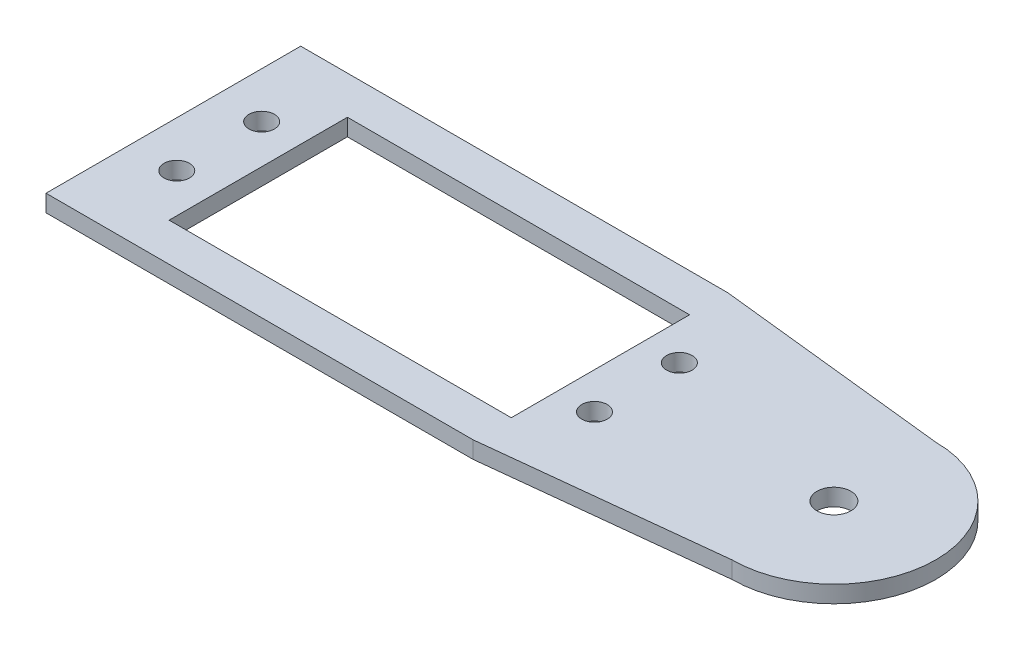
ISO-10303-21;
HEADER;
FILE_DESCRIPTION(('STEP AP214'),'2;1');
FILE_NAME('part.step','',(''),(''),'','','');
FILE_SCHEMA(('AUTOMOTIVE_DESIGN { 1 0 10303 214 1 1 1 1 }'));
ENDSEC;
DATA;
#1=APPLICATION_CONTEXT('core data for automotive mechanical design processes');
#2=APPLICATION_PROTOCOL_DEFINITION('international standard','automotive_design',2000,#1);
#3=PRODUCT_CONTEXT('',#1,'mechanical');
#4=PRODUCT('Part','Part','',(#3));
#5=PRODUCT_RELATED_PRODUCT_CATEGORY('part','',(#4));
#6=PRODUCT_DEFINITION_FORMATION('','',#4);
#7=PRODUCT_DEFINITION_CONTEXT('part definition',#1,'design');
#8=PRODUCT_DEFINITION('design','',#6,#7);
#9=PRODUCT_DEFINITION_SHAPE('','',#8);
#10=(LENGTH_UNIT() NAMED_UNIT(*) SI_UNIT(.MILLI.,.METRE.));
#11=(NAMED_UNIT(*) PLANE_ANGLE_UNIT() SI_UNIT($,.RADIAN.));
#12=(NAMED_UNIT(*) SI_UNIT($,.STERADIAN.) SOLID_ANGLE_UNIT());
#13=UNCERTAINTY_MEASURE_WITH_UNIT(LENGTH_MEASURE(1.E-05),#10,'distance_accuracy_value','');
#14=(GEOMETRIC_REPRESENTATION_CONTEXT(3) GLOBAL_UNCERTAINTY_ASSIGNED_CONTEXT((#13)) GLOBAL_UNIT_ASSIGNED_CONTEXT((#10,
#11,#12)) REPRESENTATION_CONTEXT('',''));
#15=CARTESIAN_POINT('',(0.,0.,0.));
#16=DIRECTION('',(0.,0.,1.));
#17=DIRECTION('',(1.,0.,0.));
#18=AXIS2_PLACEMENT_3D('',#15,#16,#17);
#19=CARTESIAN_POINT('',(77.8,2.,0.));
#20=DIRECTION('',(0.,1.,0.));
#21=DIRECTION('',(0.,0.,1.));
#22=AXIS2_PLACEMENT_3D('',#19,#20,#21);
#23=PLANE('',#22);
#24=CARTESIAN_POINT('',(54.6,2.,-5.));
#25=DIRECTION('',(0.,1.,0.));
#26=DIRECTION('',(0.,0.,1.));
#27=AXIS2_PLACEMENT_3D('',#24,#25,#26);
#28=CIRCLE('',#27,1.5);
#29=CARTESIAN_POINT('',(54.6,2.,-3.5));
#30=VERTEX_POINT('',#29);
#31=EDGE_CURVE('E279',#30,#30,#28,.T.);
#32=ORIENTED_EDGE('',*,*,#31,.F.);
#33=EDGE_LOOP('',(#32));
#34=FACE_BOUND('',#33,.T.);
#35=CARTESIAN_POINT('',(5.4,2.,-5.));
#36=DIRECTION('',(0.,1.,0.));
#37=DIRECTION('',(0.,0.,1.));
#38=AXIS2_PLACEMENT_3D('',#35,#36,#37);
#39=CIRCLE('',#38,1.5);
#40=CARTESIAN_POINT('',(5.4,2.,-3.5));
#41=VERTEX_POINT('',#40);
#42=EDGE_CURVE('E291',#41,#41,#39,.T.);
#43=ORIENTED_EDGE('',*,*,#42,.F.);
#44=EDGE_LOOP('',(#43));
#45=FACE_BOUND('',#44,.T.);
#46=DIRECTION('',(1.,0.,0.));
#47=VECTOR('',#46,1.);
#48=CARTESIAN_POINT('',(10.,2.,10.5));
#49=LINE('',#48,#47);
#50=CARTESIAN_POINT('',(10.,2.,10.5));
#51=VERTEX_POINT('',#50);
#52=CARTESIAN_POINT('',(50.3,2.,10.5));
#53=VERTEX_POINT('',#52);
#54=EDGE_CURVE('E120',#51,#53,#49,.T.);
#55=ORIENTED_EDGE('',*,*,#54,.F.);
#56=DIRECTION('',(0.,0.,1.));
#57=VECTOR('',#56,1.);
#58=CARTESIAN_POINT('',(10.,2.,10.5));
#59=LINE('',#58,#57);
#60=CARTESIAN_POINT('',(9.99999999999999,2.,-10.5));
#61=VERTEX_POINT('',#60);
#62=EDGE_CURVE('E112',#61,#51,#59,.T.);
#63=ORIENTED_EDGE('',*,*,#62,.F.);
#64=DIRECTION('',(-1.,0.,0.));
#65=VECTOR('',#64,1.);
#66=CARTESIAN_POINT('',(9.99999999999999,2.,-10.5));
#67=LINE('',#66,#65);
#68=CARTESIAN_POINT('',(50.3,2.,-10.5));
#69=VERTEX_POINT('',#68);
#70=EDGE_CURVE('E135',#69,#61,#67,.T.);
#71=ORIENTED_EDGE('',*,*,#70,.F.);
#72=DIRECTION('',(0.,0.,-1.));
#73=VECTOR('',#72,1.);
#74=CARTESIAN_POINT('',(50.3,2.,-10.5));
#75=LINE('',#74,#73);
#76=EDGE_CURVE('E133',#53,#69,#75,.T.);
#77=ORIENTED_EDGE('',*,*,#76,.F.);
#78=EDGE_LOOP('',(#55,#63,#71,#77));
#79=FACE_BOUND('',#78,.T.);
#80=DIRECTION('',(-0.994102176607995,0.,-0.108447510175418));
#81=VECTOR('',#80,1.);
#82=CARTESIAN_POINT('',(50.3,2.,-15.));
#83=LINE('',#82,#81);
#84=CARTESIAN_POINT('',(77.8,2.,-12.));
#85=VERTEX_POINT('',#84);
#86=CARTESIAN_POINT('',(50.3,2.,-15.));
#87=VERTEX_POINT('',#86);
#88=EDGE_CURVE('E151',#85,#87,#83,.T.);
#89=ORIENTED_EDGE('',*,*,#88,.T.);
#90=DIRECTION('',(-1.,0.,0.));
#91=VECTOR('',#90,1.);
#92=CARTESIAN_POINT('',(0.,2.,-15.));
#93=LINE('',#92,#91);
#94=CARTESIAN_POINT('',(0.,2.,-15.));
#95=VERTEX_POINT('',#94);
#96=EDGE_CURVE('E154',#87,#95,#93,.T.);
#97=ORIENTED_EDGE('',*,*,#96,.T.);
#98=DIRECTION('',(0.,0.,1.));
#99=VECTOR('',#98,1.);
#100=CARTESIAN_POINT('',(0.,2.,-15.));
#101=LINE('',#100,#99);
#102=CARTESIAN_POINT('',(0.,2.,15.));
#103=VERTEX_POINT('',#102);
#104=EDGE_CURVE('E157',#95,#103,#101,.T.);
#105=ORIENTED_EDGE('',*,*,#104,.T.);
#106=DIRECTION('',(1.,0.,0.));
#107=VECTOR('',#106,1.);
#108=CARTESIAN_POINT('',(0.,2.,15.));
#109=LINE('',#108,#107);
#110=CARTESIAN_POINT('',(50.3,2.,15.));
#111=VERTEX_POINT('',#110);
#112=EDGE_CURVE('E159',#103,#111,#109,.T.);
#113=ORIENTED_EDGE('',*,*,#112,.T.);
#114=DIRECTION('',(0.994102176607995,0.,-0.108447510175418));
#115=VECTOR('',#114,1.);
#116=CARTESIAN_POINT('',(50.3,2.,15.));
#117=LINE('',#116,#115);
#118=CARTESIAN_POINT('',(77.8,2.,12.));
#119=VERTEX_POINT('',#118);
#120=EDGE_CURVE('E161',#111,#119,#117,.T.);
#121=ORIENTED_EDGE('',*,*,#120,.T.);
#122=CARTESIAN_POINT('',(77.8,2.,0.));
#123=DIRECTION('',(0.,1.,0.));
#124=DIRECTION('',(0.,0.,1.));
#125=AXIS2_PLACEMENT_3D('',#122,#123,#124);
#126=CIRCLE('',#125,12.);
#127=EDGE_CURVE('E163',#119,#85,#126,.T.);
#128=ORIENTED_EDGE('',*,*,#127,.T.);
#129=EDGE_LOOP('',(#89,#97,#105,#113,#121,#128));
#130=FACE_BOUND('',#129,.T.);
#131=CARTESIAN_POINT('',(5.4,2.,5.));
#132=DIRECTION('',(0.,1.,0.));
#133=DIRECTION('',(0.,0.,1.));
#134=AXIS2_PLACEMENT_3D('',#131,#132,#133);
#135=CIRCLE('',#134,1.5);
#136=CARTESIAN_POINT('',(5.4,2.,6.5));
#137=VERTEX_POINT('',#136);
#138=EDGE_CURVE('E141',#137,#137,#135,.T.);
#139=ORIENTED_EDGE('',*,*,#138,.F.);
#140=EDGE_LOOP('',(#139));
#141=FACE_BOUND('',#140,.T.);
#142=CARTESIAN_POINT('',(54.6,2.,5.));
#143=DIRECTION('',(0.,1.,0.));
#144=DIRECTION('',(0.,0.,1.));
#145=AXIS2_PLACEMENT_3D('',#142,#143,#144);
#146=CIRCLE('',#145,1.5);
#147=CARTESIAN_POINT('',(54.6,2.,6.5));
#148=VERTEX_POINT('',#147);
#149=EDGE_CURVE('E285',#148,#148,#146,.T.);
#150=ORIENTED_EDGE('',*,*,#149,.F.);
#151=EDGE_LOOP('',(#150));
#152=FACE_BOUND('',#151,.T.);
#153=CARTESIAN_POINT('',(77.8,2.,0.));
#154=DIRECTION('',(0.,1.,0.));
#155=DIRECTION('',(0.,0.,1.));
#156=AXIS2_PLACEMENT_3D('',#153,#154,#155);
#157=CIRCLE('',#156,2.);
#158=CARTESIAN_POINT('',(77.8,2.,2.));
#159=VERTEX_POINT('',#158);
#160=EDGE_CURVE('E270',#159,#159,#157,.T.);
#161=ORIENTED_EDGE('',*,*,#160,.F.);
#162=EDGE_LOOP('',(#161));
#163=FACE_BOUND('',#162,.T.);
#164=ADVANCED_FACE('F35',(#34,#45,#79,#130,#141,#152,#163),#23,.T.);
#165=CARTESIAN_POINT('',(77.8,0.,0.));
#166=DIRECTION('',(0.,1.,0.));
#167=DIRECTION('',(0.,0.,1.));
#168=AXIS2_PLACEMENT_3D('',#165,#166,#167);
#169=PLANE('',#168);
#170=DIRECTION('',(-0.994102176607995,0.,-0.108447510175418));
#171=VECTOR('',#170,1.);
#172=CARTESIAN_POINT('',(50.3,0.,-15.));
#173=LINE('',#172,#171);
#174=CARTESIAN_POINT('',(77.8,0.,-12.));
#175=VERTEX_POINT('',#174);
#176=CARTESIAN_POINT('',(50.3,0.,-15.));
#177=VERTEX_POINT('',#176);
#178=EDGE_CURVE('E128',#175,#177,#173,.T.);
#179=ORIENTED_EDGE('',*,*,#178,.F.);
#180=CARTESIAN_POINT('',(77.8,0.,0.));
#181=DIRECTION('',(0.,1.,0.));
#182=DIRECTION('',(0.,0.,1.));
#183=AXIS2_PLACEMENT_3D('',#180,#181,#182);
#184=CIRCLE('',#183,12.);
#185=CARTESIAN_POINT('',(77.8,0.,12.));
#186=VERTEX_POINT('',#185);
#187=EDGE_CURVE('E155',#186,#175,#184,.T.);
#188=ORIENTED_EDGE('',*,*,#187,.F.);
#189=DIRECTION('',(0.994102176607995,0.,-0.108447510175418));
#190=VECTOR('',#189,1.);
#191=CARTESIAN_POINT('',(50.3,0.,15.));
#192=LINE('',#191,#190);
#193=CARTESIAN_POINT('',(50.3,0.,15.));
#194=VERTEX_POINT('',#193);
#195=EDGE_CURVE('E174',#194,#186,#192,.T.);
#196=ORIENTED_EDGE('',*,*,#195,.F.);
#197=DIRECTION('',(1.,0.,0.));
#198=VECTOR('',#197,1.);
#199=CARTESIAN_POINT('',(0.,0.,15.));
#200=LINE('',#199,#198);
#201=CARTESIAN_POINT('',(0.,0.,15.));
#202=VERTEX_POINT('',#201);
#203=EDGE_CURVE('E172',#202,#194,#200,.T.);
#204=ORIENTED_EDGE('',*,*,#203,.F.);
#205=DIRECTION('',(0.,0.,1.));
#206=VECTOR('',#205,1.);
#207=CARTESIAN_POINT('',(0.,0.,-15.));
#208=LINE('',#207,#206);
#209=CARTESIAN_POINT('',(0.,0.,-15.));
#210=VERTEX_POINT('',#209);
#211=EDGE_CURVE('E170',#210,#202,#208,.T.);
#212=ORIENTED_EDGE('',*,*,#211,.F.);
#213=DIRECTION('',(-1.,0.,0.));
#214=VECTOR('',#213,1.);
#215=CARTESIAN_POINT('',(0.,0.,-15.));
#216=LINE('',#215,#214);
#217=EDGE_CURVE('E168',#177,#210,#216,.T.);
#218=ORIENTED_EDGE('',*,*,#217,.F.);
#219=EDGE_LOOP('',(#179,#188,#196,#204,#212,#218));
#220=FACE_BOUND('',#219,.T.);
#221=DIRECTION('',(0.,0.,1.));
#222=VECTOR('',#221,1.);
#223=CARTESIAN_POINT('',(10.,0.,10.5));
#224=LINE('',#223,#222);
#225=CARTESIAN_POINT('',(9.99999999999999,0.,-10.5));
#226=VERTEX_POINT('',#225);
#227=CARTESIAN_POINT('',(10.,0.,10.5));
#228=VERTEX_POINT('',#227);
#229=EDGE_CURVE('E58',#226,#228,#224,.T.);
#230=ORIENTED_EDGE('',*,*,#229,.T.);
#231=DIRECTION('',(1.,0.,0.));
#232=VECTOR('',#231,1.);
#233=CARTESIAN_POINT('',(10.,0.,10.5));
#234=LINE('',#233,#232);
#235=CARTESIAN_POINT('',(50.3,0.,10.5));
#236=VERTEX_POINT('',#235);
#237=EDGE_CURVE('E127',#228,#236,#234,.T.);
#238=ORIENTED_EDGE('',*,*,#237,.T.);
#239=DIRECTION('',(0.,0.,-1.));
#240=VECTOR('',#239,1.);
#241=CARTESIAN_POINT('',(50.3,0.,-10.5));
#242=LINE('',#241,#240);
#243=CARTESIAN_POINT('',(50.3,0.,-10.5));
#244=VERTEX_POINT('',#243);
#245=EDGE_CURVE('E143',#236,#244,#242,.T.);
#246=ORIENTED_EDGE('',*,*,#245,.T.);
#247=DIRECTION('',(-1.,0.,0.));
#248=VECTOR('',#247,1.);
#249=CARTESIAN_POINT('',(9.99999999999999,0.,-10.5));
#250=LINE('',#249,#248);
#251=EDGE_CURVE('E121',#244,#226,#250,.T.);
#252=ORIENTED_EDGE('',*,*,#251,.T.);
#253=EDGE_LOOP('',(#230,#238,#246,#252));
#254=FACE_BOUND('',#253,.T.);
#255=CARTESIAN_POINT('',(5.4,0.,5.));
#256=DIRECTION('',(0.,1.,0.));
#257=DIRECTION('',(0.,0.,1.));
#258=AXIS2_PLACEMENT_3D('',#255,#256,#257);
#259=CIRCLE('',#258,1.5);
#260=CARTESIAN_POINT('',(5.4,0.,6.5));
#261=VERTEX_POINT('',#260);
#262=EDGE_CURVE('E294',#261,#261,#259,.T.);
#263=ORIENTED_EDGE('',*,*,#262,.T.);
#264=EDGE_LOOP('',(#263));
#265=FACE_BOUND('',#264,.T.);
#266=CARTESIAN_POINT('',(5.4,0.,-5.));
#267=DIRECTION('',(0.,1.,0.));
#268=DIRECTION('',(0.,0.,1.));
#269=AXIS2_PLACEMENT_3D('',#266,#267,#268);
#270=CIRCLE('',#269,1.5);
#271=CARTESIAN_POINT('',(5.4,0.,-3.5));
#272=VERTEX_POINT('',#271);
#273=EDGE_CURVE('E288',#272,#272,#270,.T.);
#274=ORIENTED_EDGE('',*,*,#273,.T.);
#275=EDGE_LOOP('',(#274));
#276=FACE_BOUND('',#275,.T.);
#277=CARTESIAN_POINT('',(54.6,0.,5.));
#278=DIRECTION('',(0.,1.,0.));
#279=DIRECTION('',(0.,0.,1.));
#280=AXIS2_PLACEMENT_3D('',#277,#278,#279);
#281=CIRCLE('',#280,1.5);
#282=CARTESIAN_POINT('',(54.6,0.,6.5));
#283=VERTEX_POINT('',#282);
#284=EDGE_CURVE('E282',#283,#283,#281,.T.);
#285=ORIENTED_EDGE('',*,*,#284,.T.);
#286=EDGE_LOOP('',(#285));
#287=FACE_BOUND('',#286,.T.);
#288=CARTESIAN_POINT('',(54.6,0.,-5.));
#289=DIRECTION('',(0.,1.,0.));
#290=DIRECTION('',(0.,0.,1.));
#291=AXIS2_PLACEMENT_3D('',#288,#289,#290);
#292=CIRCLE('',#291,1.5);
#293=CARTESIAN_POINT('',(54.6,0.,-3.5));
#294=VERTEX_POINT('',#293);
#295=EDGE_CURVE('E276',#294,#294,#292,.T.);
#296=ORIENTED_EDGE('',*,*,#295,.T.);
#297=EDGE_LOOP('',(#296));
#298=FACE_BOUND('',#297,.T.);
#299=CARTESIAN_POINT('',(77.8,0.,0.));
#300=DIRECTION('',(0.,1.,0.));
#301=DIRECTION('',(0.,0.,1.));
#302=AXIS2_PLACEMENT_3D('',#299,#300,#301);
#303=CIRCLE('',#302,2.);
#304=CARTESIAN_POINT('',(77.8,0.,2.));
#305=VERTEX_POINT('',#304);
#306=EDGE_CURVE('E273',#305,#305,#303,.T.);
#307=ORIENTED_EDGE('',*,*,#306,.T.);
#308=EDGE_LOOP('',(#307));
#309=FACE_BOUND('',#308,.T.);
#310=ADVANCED_FACE('F198',(#220,#254,#265,#276,#287,#298,#309),#169,.F.);
#311=CARTESIAN_POINT('',(50.3,2.,-15.));
#312=DIRECTION('',(-0.108447510175418,0.,0.994102176607995));
#313=DIRECTION('',(0.994102176607995,0.,0.108447510175418));
#314=AXIS2_PLACEMENT_3D('',#311,#312,#313);
#315=PLANE('',#314);
#316=ORIENTED_EDGE('',*,*,#178,.T.);
#317=DIRECTION('',(0.,-1.,0.));
#318=VECTOR('',#317,1.);
#319=CARTESIAN_POINT('',(50.3,2.,-15.));
#320=LINE('',#319,#318);
#321=EDGE_CURVE('E11',#87,#177,#320,.T.);
#322=ORIENTED_EDGE('',*,*,#321,.F.);
#323=ORIENTED_EDGE('',*,*,#88,.F.);
#324=DIRECTION('',(0.,-1.,0.));
#325=VECTOR('',#324,1.);
#326=CARTESIAN_POINT('',(77.8,2.,-12.));
#327=LINE('',#326,#325);
#328=EDGE_CURVE('E165',#85,#175,#327,.T.);
#329=ORIENTED_EDGE('',*,*,#328,.T.);
#330=EDGE_LOOP('',(#316,#322,#323,#329));
#331=FACE_BOUND('',#330,.T.);
#332=ADVANCED_FACE('F37',(#331),#315,.F.);
#333=CARTESIAN_POINT('',(0.,2.,-15.));
#334=DIRECTION('',(0.,0.,1.));
#335=DIRECTION('',(1.,0.,0.));
#336=AXIS2_PLACEMENT_3D('',#333,#334,#335);
#337=PLANE('',#336);
#338=ORIENTED_EDGE('',*,*,#217,.T.);
#339=DIRECTION('',(0.,-1.,0.));
#340=VECTOR('',#339,1.);
#341=CARTESIAN_POINT('',(0.,2.,-15.));
#342=LINE('',#341,#340);
#343=EDGE_CURVE('E43',#95,#210,#342,.T.);
#344=ORIENTED_EDGE('',*,*,#343,.F.);
#345=ORIENTED_EDGE('',*,*,#96,.F.);
#346=ORIENTED_EDGE('',*,*,#321,.T.);
#347=EDGE_LOOP('',(#338,#344,#345,#346));
#348=FACE_BOUND('',#347,.T.);
#349=ADVANCED_FACE('F215',(#348),#337,.F.);
#350=CARTESIAN_POINT('',(0.,2.,-15.));
#351=DIRECTION('',(1.,0.,0.));
#352=DIRECTION('',(0.,0.,-1.));
#353=AXIS2_PLACEMENT_3D('',#350,#351,#352);
#354=PLANE('',#353);
#355=ORIENTED_EDGE('',*,*,#211,.T.);
#356=DIRECTION('',(0.,-1.,0.));
#357=VECTOR('',#356,1.);
#358=CARTESIAN_POINT('',(0.,2.,15.));
#359=LINE('',#358,#357);
#360=EDGE_CURVE('E185',#103,#202,#359,.T.);
#361=ORIENTED_EDGE('',*,*,#360,.F.);
#362=ORIENTED_EDGE('',*,*,#104,.F.);
#363=ORIENTED_EDGE('',*,*,#343,.T.);
#364=EDGE_LOOP('',(#355,#361,#362,#363));
#365=FACE_BOUND('',#364,.T.);
#366=ADVANCED_FACE('F192',(#365),#354,.F.);
#367=CARTESIAN_POINT('',(0.,2.,15.));
#368=DIRECTION('',(0.,0.,-1.));
#369=DIRECTION('',(-1.,0.,0.));
#370=AXIS2_PLACEMENT_3D('',#367,#368,#369);
#371=PLANE('',#370);
#372=ORIENTED_EDGE('',*,*,#203,.T.);
#373=DIRECTION('',(0.,-1.,0.));
#374=VECTOR('',#373,1.);
#375=CARTESIAN_POINT('',(50.3,2.,15.));
#376=LINE('',#375,#374);
#377=EDGE_CURVE('E182',#111,#194,#376,.T.);
#378=ORIENTED_EDGE('',*,*,#377,.F.);
#379=ORIENTED_EDGE('',*,*,#112,.F.);
#380=ORIENTED_EDGE('',*,*,#360,.T.);
#381=EDGE_LOOP('',(#372,#378,#379,#380));
#382=FACE_BOUND('',#381,.T.);
#383=ADVANCED_FACE('F204',(#382),#371,.F.);
#384=CARTESIAN_POINT('',(50.3,2.,15.));
#385=DIRECTION('',(-0.108447510175418,0.,-0.994102176607995));
#386=DIRECTION('',(-0.994102176607995,0.,0.108447510175418));
#387=AXIS2_PLACEMENT_3D('',#384,#385,#386);
#388=PLANE('',#387);
#389=ORIENTED_EDGE('',*,*,#195,.T.);
#390=DIRECTION('',(0.,-1.,0.));
#391=VECTOR('',#390,1.);
#392=CARTESIAN_POINT('',(77.8,2.,12.));
#393=LINE('',#392,#391);
#394=EDGE_CURVE('E179',#119,#186,#393,.T.);
#395=ORIENTED_EDGE('',*,*,#394,.F.);
#396=ORIENTED_EDGE('',*,*,#120,.F.);
#397=ORIENTED_EDGE('',*,*,#377,.T.);
#398=EDGE_LOOP('',(#389,#395,#396,#397));
#399=FACE_BOUND('',#398,.T.);
#400=ADVANCED_FACE('F208',(#399),#388,.F.);
#401=CARTESIAN_POINT('',(77.8,2.,0.));
#402=DIRECTION('',(0.,-1.,0.));
#403=DIRECTION('',(0.,0.,-1.));
#404=AXIS2_PLACEMENT_3D('',#401,#402,#403);
#405=CYLINDRICAL_SURFACE('',#404,12.);
#406=ORIENTED_EDGE('',*,*,#187,.T.);
#407=ORIENTED_EDGE('',*,*,#328,.F.);
#408=ORIENTED_EDGE('',*,*,#127,.F.);
#409=ORIENTED_EDGE('',*,*,#394,.T.);
#410=EDGE_LOOP('',(#406,#407,#408,#409));
#411=FACE_BOUND('',#410,.T.);
#412=ADVANCED_FACE('F218',(#411),#405,.T.);
#413=CARTESIAN_POINT('',(10.,2.,10.5));
#414=DIRECTION('',(1.,0.,0.));
#415=DIRECTION('',(0.,0.,-1.));
#416=AXIS2_PLACEMENT_3D('',#413,#414,#415);
#417=PLANE('',#416);
#418=ORIENTED_EDGE('',*,*,#229,.F.);
#419=DIRECTION('',(0.,-1.,0.));
#420=VECTOR('',#419,1.);
#421=CARTESIAN_POINT('',(9.99999999999999,2.,-10.5));
#422=LINE('',#421,#420);
#423=EDGE_CURVE('E116',#61,#226,#422,.T.);
#424=ORIENTED_EDGE('',*,*,#423,.F.);
#425=ORIENTED_EDGE('',*,*,#62,.T.);
#426=DIRECTION('',(0.,-1.,0.));
#427=VECTOR('',#426,1.);
#428=CARTESIAN_POINT('',(10.,2.,10.5));
#429=LINE('',#428,#427);
#430=EDGE_CURVE('E115',#51,#228,#429,.T.);
#431=ORIENTED_EDGE('',*,*,#430,.T.);
#432=EDGE_LOOP('',(#418,#424,#425,#431));
#433=FACE_BOUND('',#432,.T.);
#434=ADVANCED_FACE('F114',(#433),#417,.T.);
#435=CARTESIAN_POINT('',(10.,2.,10.5));
#436=DIRECTION('',(0.,0.,-1.));
#437=DIRECTION('',(-1.,0.,0.));
#438=AXIS2_PLACEMENT_3D('',#435,#436,#437);
#439=PLANE('',#438);
#440=ORIENTED_EDGE('',*,*,#237,.F.);
#441=ORIENTED_EDGE('',*,*,#430,.F.);
#442=ORIENTED_EDGE('',*,*,#54,.T.);
#443=DIRECTION('',(0.,-1.,0.));
#444=VECTOR('',#443,1.);
#445=CARTESIAN_POINT('',(50.3,2.,10.5));
#446=LINE('',#445,#444);
#447=EDGE_CURVE('E129',#53,#236,#446,.T.);
#448=ORIENTED_EDGE('',*,*,#447,.T.);
#449=EDGE_LOOP('',(#440,#441,#442,#448));
#450=FACE_BOUND('',#449,.T.);
#451=ADVANCED_FACE('F124',(#450),#439,.T.);
#452=CARTESIAN_POINT('',(50.3,2.,-10.5));
#453=DIRECTION('',(-1.,0.,0.));
#454=DIRECTION('',(0.,0.,1.));
#455=AXIS2_PLACEMENT_3D('',#452,#453,#454);
#456=PLANE('',#455);
#457=ORIENTED_EDGE('',*,*,#245,.F.);
#458=ORIENTED_EDGE('',*,*,#447,.F.);
#459=ORIENTED_EDGE('',*,*,#76,.T.);
#460=DIRECTION('',(0.,-1.,0.));
#461=VECTOR('',#460,1.);
#462=CARTESIAN_POINT('',(50.3,2.,-10.5));
#463=LINE('',#462,#461);
#464=EDGE_CURVE('E50',#69,#244,#463,.T.);
#465=ORIENTED_EDGE('',*,*,#464,.T.);
#466=EDGE_LOOP('',(#457,#458,#459,#465));
#467=FACE_BOUND('',#466,.T.);
#468=ADVANCED_FACE('F239',(#467),#456,.T.);
#469=CARTESIAN_POINT('',(9.99999999999999,2.,-10.5));
#470=DIRECTION('',(0.,0.,1.));
#471=DIRECTION('',(1.,0.,0.));
#472=AXIS2_PLACEMENT_3D('',#469,#470,#471);
#473=PLANE('',#472);
#474=ORIENTED_EDGE('',*,*,#251,.F.);
#475=ORIENTED_EDGE('',*,*,#464,.F.);
#476=ORIENTED_EDGE('',*,*,#70,.T.);
#477=ORIENTED_EDGE('',*,*,#423,.T.);
#478=EDGE_LOOP('',(#474,#475,#476,#477));
#479=FACE_BOUND('',#478,.T.);
#480=ADVANCED_FACE('F242',(#479),#473,.T.);
#481=CARTESIAN_POINT('',(5.4,2.,5.));
#482=DIRECTION('',(0.,-1.,0.));
#483=DIRECTION('',(0.,0.,-1.));
#484=AXIS2_PLACEMENT_3D('',#481,#482,#483);
#485=CYLINDRICAL_SURFACE('',#484,1.5);
#486=ORIENTED_EDGE('',*,*,#138,.T.);
#487=EDGE_LOOP('',(#486));
#488=FACE_BOUND('',#487,.T.);
#489=ORIENTED_EDGE('',*,*,#262,.F.);
#490=EDGE_LOOP('',(#489));
#491=FACE_BOUND('',#490,.T.);
#492=ADVANCED_FACE('F246',(#488,#491),#485,.F.);
#493=CARTESIAN_POINT('',(5.4,2.,-5.));
#494=DIRECTION('',(0.,-1.,0.));
#495=DIRECTION('',(0.,0.,-1.));
#496=AXIS2_PLACEMENT_3D('',#493,#494,#495);
#497=CYLINDRICAL_SURFACE('',#496,1.5);
#498=ORIENTED_EDGE('',*,*,#42,.T.);
#499=EDGE_LOOP('',(#498));
#500=FACE_BOUND('',#499,.T.);
#501=ORIENTED_EDGE('',*,*,#273,.F.);
#502=EDGE_LOOP('',(#501));
#503=FACE_BOUND('',#502,.T.);
#504=ADVANCED_FACE('F249',(#500,#503),#497,.F.);
#505=CARTESIAN_POINT('',(54.6,2.,5.));
#506=DIRECTION('',(0.,-1.,0.));
#507=DIRECTION('',(0.,0.,-1.));
#508=AXIS2_PLACEMENT_3D('',#505,#506,#507);
#509=CYLINDRICAL_SURFACE('',#508,1.5);
#510=ORIENTED_EDGE('',*,*,#149,.T.);
#511=EDGE_LOOP('',(#510));
#512=FACE_BOUND('',#511,.T.);
#513=ORIENTED_EDGE('',*,*,#284,.F.);
#514=EDGE_LOOP('',(#513));
#515=FACE_BOUND('',#514,.T.);
#516=ADVANCED_FACE('F253',(#512,#515),#509,.F.);
#517=CARTESIAN_POINT('',(54.6,2.,-5.));
#518=DIRECTION('',(0.,-1.,0.));
#519=DIRECTION('',(0.,0.,-1.));
#520=AXIS2_PLACEMENT_3D('',#517,#518,#519);
#521=CYLINDRICAL_SURFACE('',#520,1.5);
#522=ORIENTED_EDGE('',*,*,#31,.T.);
#523=EDGE_LOOP('',(#522));
#524=FACE_BOUND('',#523,.T.);
#525=ORIENTED_EDGE('',*,*,#295,.F.);
#526=EDGE_LOOP('',(#525));
#527=FACE_BOUND('',#526,.T.);
#528=ADVANCED_FACE('F257',(#524,#527),#521,.F.);
#529=CARTESIAN_POINT('',(77.8,2.,0.));
#530=DIRECTION('',(0.,-1.,0.));
#531=DIRECTION('',(0.,0.,-1.));
#532=AXIS2_PLACEMENT_3D('',#529,#530,#531);
#533=CYLINDRICAL_SURFACE('',#532,2.);
#534=ORIENTED_EDGE('',*,*,#160,.T.);
#535=EDGE_LOOP('',(#534));
#536=FACE_BOUND('',#535,.T.);
#537=ORIENTED_EDGE('',*,*,#306,.F.);
#538=EDGE_LOOP('',(#537));
#539=FACE_BOUND('',#538,.T.);
#540=ADVANCED_FACE('F261',(#536,#539),#533,.F.);
#541=CLOSED_SHELL('',(#164,#310,#332,#349,#366,#383,#400,#412,#434,#451,#468,#480,#492,#504,
#516,#528,#540));
#542=MANIFOLD_SOLID_BREP('B2',#541);
#543=ADVANCED_BREP_SHAPE_REPRESENTATION('',(#18,#542),#14);
#544=SHAPE_DEFINITION_REPRESENTATION(#9,#543);
ENDSEC;
END-ISO-10303-21;
